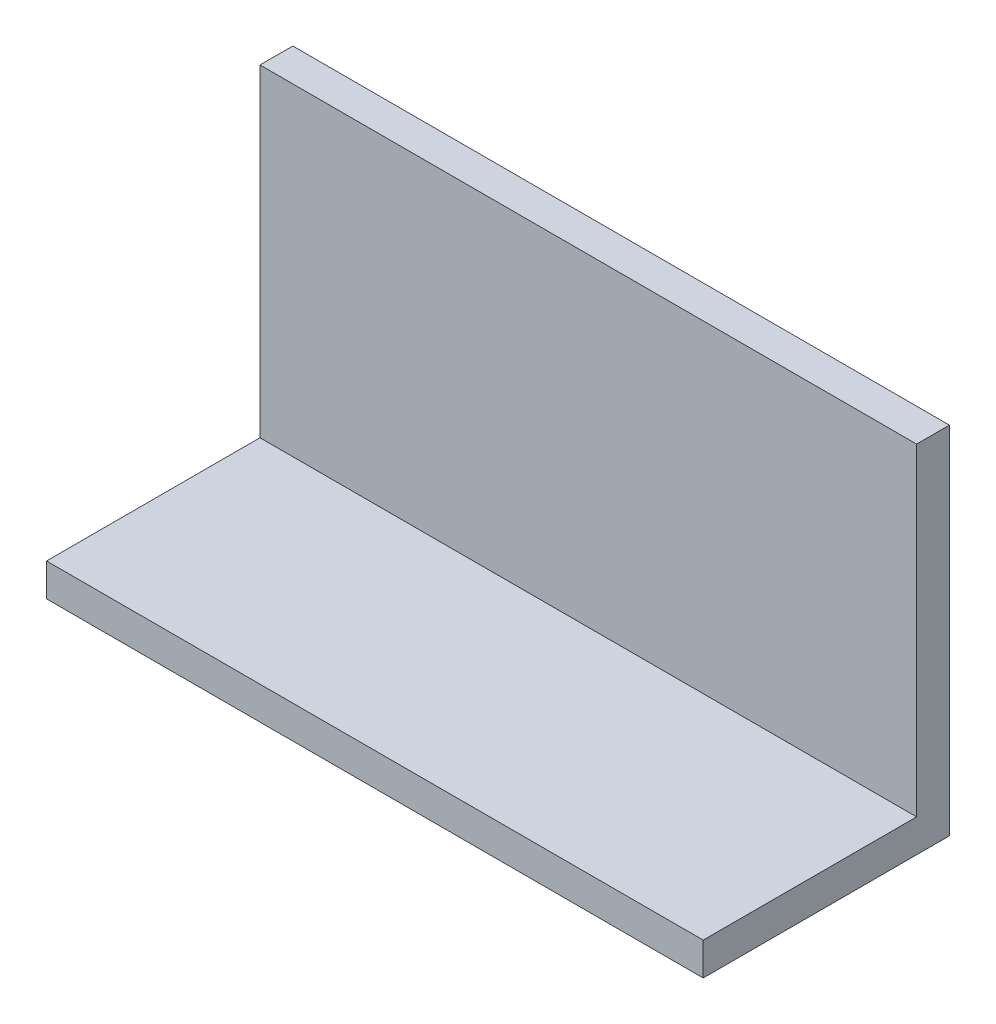
ISO-10303-21;
HEADER;
FILE_DESCRIPTION(('STEP AP214'),'2;1');
FILE_NAME('part.step','',(''),(''),'','','');
FILE_SCHEMA(('AUTOMOTIVE_DESIGN { 1 0 10303 214 1 1 1 1 }'));
ENDSEC;
DATA;
#1=APPLICATION_CONTEXT('core data for automotive mechanical design processes');
#2=APPLICATION_PROTOCOL_DEFINITION('international standard','automotive_design',2000,#1);
#3=PRODUCT_CONTEXT('',#1,'mechanical');
#4=PRODUCT('Part','Part','',(#3));
#5=PRODUCT_RELATED_PRODUCT_CATEGORY('part','',(#4));
#6=PRODUCT_DEFINITION_FORMATION('','',#4);
#7=PRODUCT_DEFINITION_CONTEXT('part definition',#1,'design');
#8=PRODUCT_DEFINITION('design','',#6,#7);
#9=PRODUCT_DEFINITION_SHAPE('','',#8);
#10=(LENGTH_UNIT() NAMED_UNIT(*) SI_UNIT(.MILLI.,.METRE.));
#11=(NAMED_UNIT(*) PLANE_ANGLE_UNIT() SI_UNIT($,.RADIAN.));
#12=(NAMED_UNIT(*) SI_UNIT($,.STERADIAN.) SOLID_ANGLE_UNIT());
#13=UNCERTAINTY_MEASURE_WITH_UNIT(LENGTH_MEASURE(1.E-05),#10,'distance_accuracy_value','');
#14=(GEOMETRIC_REPRESENTATION_CONTEXT(3) GLOBAL_UNCERTAINTY_ASSIGNED_CONTEXT((#13)) GLOBAL_UNIT_ASSIGNED_CONTEXT((#10,
#11,#12)) REPRESENTATION_CONTEXT('',''));
#15=CARTESIAN_POINT('',(0.,0.,0.));
#16=DIRECTION('',(0.,0.,1.));
#17=DIRECTION('',(1.,0.,0.));
#18=AXIS2_PLACEMENT_3D('',#15,#16,#17);
#19=CARTESIAN_POINT('',(0.,0.,90.));
#20=DIRECTION('',(1.,0.,0.));
#21=DIRECTION('',(0.,1.,0.));
#22=AXIS2_PLACEMENT_3D('',#19,#20,#21);
#23=PLANE('',#22);
#24=DIRECTION('',(0.,-1.,0.));
#25=VECTOR('',#24,1.);
#26=CARTESIAN_POINT('',(0.,0.,90.));
#27=LINE('',#26,#25);
#28=CARTESIAN_POINT('',(0.,12.,90.));
#29=VERTEX_POINT('',#28);
#30=CARTESIAN_POINT('',(0.,0.,90.));
#31=VERTEX_POINT('',#30);
#32=EDGE_CURVE('E96',#29,#31,#27,.T.);
#33=ORIENTED_EDGE('',*,*,#32,.F.);
#34=DIRECTION('',(0.,0.,1.));
#35=VECTOR('',#34,1.);
#36=CARTESIAN_POINT('',(0.,12.,90.));
#37=LINE('',#36,#35);
#38=CARTESIAN_POINT('',(0.,12.,12.));
#39=VERTEX_POINT('',#38);
#40=EDGE_CURVE('E46',#39,#29,#37,.T.);
#41=ORIENTED_EDGE('',*,*,#40,.F.);
#42=DIRECTION('',(0.,-1.,0.));
#43=VECTOR('',#42,1.);
#44=CARTESIAN_POINT('',(0.,130.,12.));
#45=LINE('',#44,#43);
#46=CARTESIAN_POINT('',(0.,130.,12.));
#47=VERTEX_POINT('',#46);
#48=EDGE_CURVE('E83',#47,#39,#45,.T.);
#49=ORIENTED_EDGE('',*,*,#48,.F.);
#50=DIRECTION('',(0.,0.,-1.));
#51=VECTOR('',#50,1.);
#52=CARTESIAN_POINT('',(0.,130.,90.));
#53=LINE('',#52,#51);
#54=CARTESIAN_POINT('',(0.,130.,0.));
#55=VERTEX_POINT('',#54);
#56=EDGE_CURVE('E75',#47,#55,#53,.T.);
#57=ORIENTED_EDGE('',*,*,#56,.T.);
#58=DIRECTION('',(0.,-1.,0.));
#59=VECTOR('',#58,1.);
#60=CARTESIAN_POINT('',(0.,0.,0.));
#61=LINE('',#60,#59);
#62=CARTESIAN_POINT('',(0.,0.,0.));
#63=VERTEX_POINT('',#62);
#64=EDGE_CURVE('E80',#55,#63,#61,.T.);
#65=ORIENTED_EDGE('',*,*,#64,.T.);
#66=DIRECTION('',(0.,0.,-1.));
#67=VECTOR('',#66,1.);
#68=CARTESIAN_POINT('',(0.,0.,90.));
#69=LINE('',#68,#67);
#70=EDGE_CURVE('E11',#31,#63,#69,.T.);
#71=ORIENTED_EDGE('',*,*,#70,.F.);
#72=EDGE_LOOP('',(#33,#41,#49,#57,#65,#71));
#73=FACE_BOUND('',#72,.T.);
#74=ADVANCED_FACE('F32',(#73),#23,.F.);
#75=CARTESIAN_POINT('',(0.,0.,90.));
#76=DIRECTION('',(0.,1.,0.));
#77=DIRECTION('',(0.,0.,1.));
#78=AXIS2_PLACEMENT_3D('',#75,#76,#77);
#79=PLANE('',#78);
#80=DIRECTION('',(1.,0.,0.));
#81=VECTOR('',#80,1.);
#82=CARTESIAN_POINT('',(0.,0.,0.));
#83=LINE('',#82,#81);
#84=CARTESIAN_POINT('',(240.,0.,0.));
#85=VERTEX_POINT('',#84);
#86=EDGE_CURVE('E100',#63,#85,#83,.T.);
#87=ORIENTED_EDGE('',*,*,#86,.T.);
#88=DIRECTION('',(0.,0.,-1.));
#89=VECTOR('',#88,1.);
#90=CARTESIAN_POINT('',(240.,0.,90.));
#91=LINE('',#90,#89);
#92=CARTESIAN_POINT('',(240.,0.,90.));
#93=VERTEX_POINT('',#92);
#94=EDGE_CURVE('E39',#93,#85,#91,.T.);
#95=ORIENTED_EDGE('',*,*,#94,.F.);
#96=DIRECTION('',(1.,0.,0.));
#97=VECTOR('',#96,1.);
#98=CARTESIAN_POINT('',(0.,0.,90.));
#99=LINE('',#98,#97);
#100=EDGE_CURVE('E55',#31,#93,#99,.T.);
#101=ORIENTED_EDGE('',*,*,#100,.F.);
#102=ORIENTED_EDGE('',*,*,#70,.T.);
#103=EDGE_LOOP('',(#87,#95,#101,#102));
#104=FACE_BOUND('',#103,.T.);
#105=ADVANCED_FACE('F117',(#104),#79,.F.);
#106=CARTESIAN_POINT('',(240.,0.,90.));
#107=DIRECTION('',(-1.,0.,0.));
#108=DIRECTION('',(0.,-1.,0.));
#109=AXIS2_PLACEMENT_3D('',#106,#107,#108);
#110=PLANE('',#109);
#111=DIRECTION('',(0.,-1.,0.));
#112=VECTOR('',#111,1.);
#113=CARTESIAN_POINT('',(240.,130.,12.));
#114=LINE('',#113,#112);
#115=CARTESIAN_POINT('',(240.,130.,12.));
#116=VERTEX_POINT('',#115);
#117=CARTESIAN_POINT('',(240.,12.0000000000001,12.));
#118=VERTEX_POINT('',#117);
#119=EDGE_CURVE('E127',#116,#118,#114,.T.);
#120=ORIENTED_EDGE('',*,*,#119,.T.);
#121=DIRECTION('',(0.,0.,1.));
#122=VECTOR('',#121,1.);
#123=CARTESIAN_POINT('',(240.,12.0000000000001,90.));
#124=LINE('',#123,#122);
#125=CARTESIAN_POINT('',(240.,12.0000000000001,90.));
#126=VERTEX_POINT('',#125);
#127=EDGE_CURVE('E124',#118,#126,#124,.T.);
#128=ORIENTED_EDGE('',*,*,#127,.T.);
#129=DIRECTION('',(0.,1.,0.));
#130=VECTOR('',#129,1.);
#131=CARTESIAN_POINT('',(240.,0.,90.));
#132=LINE('',#131,#130);
#133=EDGE_CURVE('E87',#93,#126,#132,.T.);
#134=ORIENTED_EDGE('',*,*,#133,.F.);
#135=ORIENTED_EDGE('',*,*,#94,.T.);
#136=DIRECTION('',(0.,1.,0.));
#137=VECTOR('',#136,1.);
#138=CARTESIAN_POINT('',(240.,0.,0.));
#139=LINE('',#138,#137);
#140=CARTESIAN_POINT('',(240.,130.,0.));
#141=VERTEX_POINT('',#140);
#142=EDGE_CURVE('E97',#85,#141,#139,.T.);
#143=ORIENTED_EDGE('',*,*,#142,.T.);
#144=DIRECTION('',(0.,0.,-1.));
#145=VECTOR('',#144,1.);
#146=CARTESIAN_POINT('',(240.,130.,90.));
#147=LINE('',#146,#145);
#148=EDGE_CURVE('E86',#116,#141,#147,.T.);
#149=ORIENTED_EDGE('',*,*,#148,.F.);
#150=EDGE_LOOP('',(#120,#128,#134,#135,#143,#149));
#151=FACE_BOUND('',#150,.T.);
#152=ADVANCED_FACE('F114',(#151),#110,.F.);
#153=CARTESIAN_POINT('',(0.,130.,90.));
#154=DIRECTION('',(0.,-1.,0.));
#155=DIRECTION('',(0.,0.,-1.));
#156=AXIS2_PLACEMENT_3D('',#153,#154,#155);
#157=PLANE('',#156);
#158=ORIENTED_EDGE('',*,*,#56,.F.);
#159=DIRECTION('',(-1.,0.,0.));
#160=VECTOR('',#159,1.);
#161=CARTESIAN_POINT('',(240.,130.,12.));
#162=LINE('',#161,#160);
#163=EDGE_CURVE('E121',#116,#47,#162,.T.);
#164=ORIENTED_EDGE('',*,*,#163,.F.);
#165=ORIENTED_EDGE('',*,*,#148,.T.);
#166=DIRECTION('',(-1.,0.,0.));
#167=VECTOR('',#166,1.);
#168=CARTESIAN_POINT('',(0.,130.,0.));
#169=LINE('',#168,#167);
#170=EDGE_CURVE('E90',#141,#55,#169,.T.);
#171=ORIENTED_EDGE('',*,*,#170,.T.);
#172=EDGE_LOOP('',(#158,#164,#165,#171));
#173=FACE_BOUND('',#172,.T.);
#174=ADVANCED_FACE('F91',(#173),#157,.F.);
#175=CARTESIAN_POINT('',(0.,0.,90.));
#176=DIRECTION('',(0.,0.,-1.));
#177=DIRECTION('',(-1.,0.,0.));
#178=AXIS2_PLACEMENT_3D('',#175,#176,#177);
#179=PLANE('',#178);
#180=ORIENTED_EDGE('',*,*,#133,.T.);
#181=DIRECTION('',(-1.,0.,0.));
#182=VECTOR('',#181,1.);
#183=CARTESIAN_POINT('',(240.,12.0000000000001,90.));
#184=LINE('',#183,#182);
#185=EDGE_CURVE('E101',#126,#29,#184,.T.);
#186=ORIENTED_EDGE('',*,*,#185,.T.);
#187=ORIENTED_EDGE('',*,*,#32,.T.);
#188=ORIENTED_EDGE('',*,*,#100,.T.);
#189=EDGE_LOOP('',(#180,#186,#187,#188));
#190=FACE_BOUND('',#189,.T.);
#191=ADVANCED_FACE('F142',(#190),#179,.F.);
#192=CARTESIAN_POINT('',(0.,0.,0.));
#193=DIRECTION('',(0.,0.,-1.));
#194=DIRECTION('',(-1.,0.,0.));
#195=AXIS2_PLACEMENT_3D('',#192,#193,#194);
#196=PLANE('',#195);
#197=ORIENTED_EDGE('',*,*,#64,.F.);
#198=ORIENTED_EDGE('',*,*,#170,.F.);
#199=ORIENTED_EDGE('',*,*,#142,.F.);
#200=ORIENTED_EDGE('',*,*,#86,.F.);
#201=EDGE_LOOP('',(#197,#198,#199,#200));
#202=FACE_BOUND('',#201,.T.);
#203=ADVANCED_FACE('F99',(#202),#196,.T.);
#204=CARTESIAN_POINT('',(240.,12.0000000000001,90.));
#205=DIRECTION('',(0.,-1.,0.));
#206=DIRECTION('',(1.,0.,0.));
#207=AXIS2_PLACEMENT_3D('',#204,#205,#206);
#208=PLANE('',#207);
#209=ORIENTED_EDGE('',*,*,#40,.T.);
#210=ORIENTED_EDGE('',*,*,#185,.F.);
#211=ORIENTED_EDGE('',*,*,#127,.F.);
#212=DIRECTION('',(-1.,0.,0.));
#213=VECTOR('',#212,1.);
#214=CARTESIAN_POINT('',(240.,12.0000000000001,12.));
#215=LINE('',#214,#213);
#216=EDGE_CURVE('E104',#118,#39,#215,.T.);
#217=ORIENTED_EDGE('',*,*,#216,.T.);
#218=EDGE_LOOP('',(#209,#210,#211,#217));
#219=FACE_BOUND('',#218,.T.);
#220=ADVANCED_FACE('F141',(#219),#208,.F.);
#221=CARTESIAN_POINT('',(240.,130.,12.));
#222=DIRECTION('',(0.,0.,-1.));
#223=DIRECTION('',(0.,1.,0.));
#224=AXIS2_PLACEMENT_3D('',#221,#222,#223);
#225=PLANE('',#224);
#226=ORIENTED_EDGE('',*,*,#48,.T.);
#227=ORIENTED_EDGE('',*,*,#216,.F.);
#228=ORIENTED_EDGE('',*,*,#119,.F.);
#229=ORIENTED_EDGE('',*,*,#163,.T.);
#230=EDGE_LOOP('',(#226,#227,#228,#229));
#231=FACE_BOUND('',#230,.T.);
#232=ADVANCED_FACE('F137',(#231),#225,.F.);
#233=CLOSED_SHELL('',(#74,#105,#152,#174,#191,#203,#220,#232));
#234=MANIFOLD_SOLID_BREP('B2',#233);
#235=ADVANCED_BREP_SHAPE_REPRESENTATION('',(#18,#234),#14);
#236=SHAPE_DEFINITION_REPRESENTATION(#9,#235);
ENDSEC;
END-ISO-10303-21;
